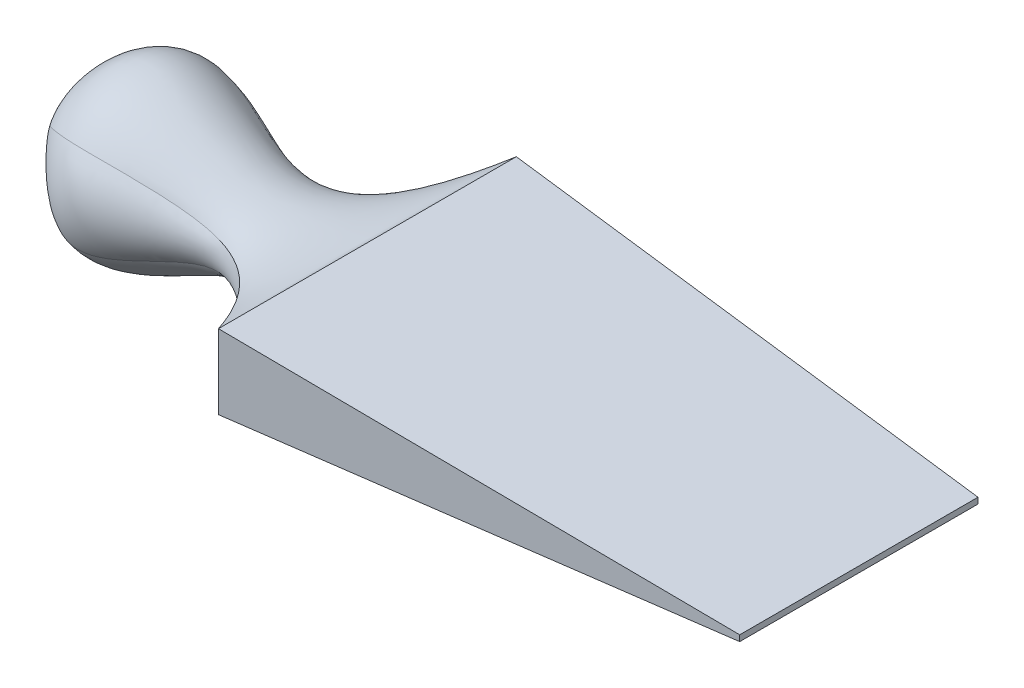
ISO-10303-21;
HEADER;
FILE_DESCRIPTION(('STEP AP214'),'2;1');
FILE_NAME('part.step','',(''),(''),'','','');
FILE_SCHEMA(('AUTOMOTIVE_DESIGN { 1 0 10303 214 1 1 1 1 }'));
ENDSEC;
DATA;
#1=APPLICATION_CONTEXT('core data for automotive mechanical design processes');
#2=APPLICATION_PROTOCOL_DEFINITION('international standard','automotive_design',2000,#1);
#3=PRODUCT_CONTEXT('',#1,'mechanical');
#4=PRODUCT('Part','Part','',(#3));
#5=PRODUCT_RELATED_PRODUCT_CATEGORY('part','',(#4));
#6=PRODUCT_DEFINITION_FORMATION('','',#4);
#7=PRODUCT_DEFINITION_CONTEXT('part definition',#1,'design');
#8=PRODUCT_DEFINITION('design','',#6,#7);
#9=PRODUCT_DEFINITION_SHAPE('','',#8);
#10=(LENGTH_UNIT() NAMED_UNIT(*) SI_UNIT(.MILLI.,.METRE.));
#11=(NAMED_UNIT(*) PLANE_ANGLE_UNIT() SI_UNIT($,.RADIAN.));
#12=(NAMED_UNIT(*) SI_UNIT($,.STERADIAN.) SOLID_ANGLE_UNIT());
#13=UNCERTAINTY_MEASURE_WITH_UNIT(LENGTH_MEASURE(1.E-05),#10,'distance_accuracy_value','');
#14=(GEOMETRIC_REPRESENTATION_CONTEXT(3) GLOBAL_UNCERTAINTY_ASSIGNED_CONTEXT((#13)) GLOBAL_UNIT_ASSIGNED_CONTEXT((#10,
#11,#12)) REPRESENTATION_CONTEXT('',''));
#15=CARTESIAN_POINT('',(0.,0.,0.));
#16=DIRECTION('',(0.,0.,1.));
#17=DIRECTION('',(1.,0.,0.));
#18=AXIS2_PLACEMENT_3D('',#15,#16,#17);
#19=CARTESIAN_POINT('',(0.,0.,0.));
#20=DIRECTION('',(1.,0.,0.));
#21=DIRECTION('',(0.,0.,-1.));
#22=AXIS2_PLACEMENT_3D('',#19,#20,#21);
#23=PLANE('',#22);
#24=CARTESIAN_POINT('',(0.,0.,0.));
#25=DIRECTION('',(1.,0.,0.));
#26=DIRECTION('',(0.,0.,-1.));
#27=AXIS2_PLACEMENT_3D('',#24,#25,#26);
#28=CIRCLE('',#27,12.5);
#29=CARTESIAN_POINT('',(0.,-5.,11.4564392373896));
#30=VERTEX_POINT('',#29);
#31=CARTESIAN_POINT('',(0.,-5.,-11.4564392373896));
#32=VERTEX_POINT('',#31);
#33=EDGE_CURVE('E202',#30,#32,#28,.T.);
#34=ORIENTED_EDGE('',*,*,#33,.F.);
#35=CARTESIAN_POINT('',(0.,0.,0.));
#36=DIRECTION('',(1.,0.,0.));
#37=DIRECTION('',(0.,0.,-1.));
#38=AXIS2_PLACEMENT_3D('',#35,#36,#37);
#39=CIRCLE('',#38,12.5);
#40=CARTESIAN_POINT('',(0.,5.,11.4564392373896));
#41=VERTEX_POINT('',#40);
#42=EDGE_CURVE('E374',#41,#30,#39,.T.);
#43=ORIENTED_EDGE('',*,*,#42,.F.);
#44=CARTESIAN_POINT('',(0.,0.,0.));
#45=DIRECTION('',(1.,0.,0.));
#46=DIRECTION('',(0.,0.,-1.));
#47=AXIS2_PLACEMENT_3D('',#44,#45,#46);
#48=CIRCLE('',#47,12.5);
#49=CARTESIAN_POINT('',(0.,5.,-11.4564392373896));
#50=VERTEX_POINT('',#49);
#51=EDGE_CURVE('E371',#50,#41,#48,.T.);
#52=ORIENTED_EDGE('',*,*,#51,.F.);
#53=CARTESIAN_POINT('',(0.,0.,0.));
#54=DIRECTION('',(1.,0.,0.));
#55=DIRECTION('',(0.,0.,-1.));
#56=AXIS2_PLACEMENT_3D('',#53,#54,#55);
#57=CIRCLE('',#56,12.5);
#58=EDGE_CURVE('E365',#32,#50,#57,.T.);
#59=ORIENTED_EDGE('',*,*,#58,.F.);
#60=EDGE_LOOP('',(#34,#43,#52,#59));
#61=FACE_BOUND('',#60,.T.);
#62=ADVANCED_FACE('F135',(#61),#23,.F.);
#63=CARTESIAN_POINT('',(0.,5.,-11.4564392373896));
#64=CARTESIAN_POINT('',(6.41191300264353,11.6666666666667,-18.6560882982515));
#65=CARTESIAN_POINT('',(23.2263205782851,20.1123380947418,-29.2990996489488));
#66=CARTESIAN_POINT('',(63.2802605538412,-1.50808446607532,-4.35100390714433));
#67=CARTESIAN_POINT('',(85.5143825220001,7.03840947148888,-32.3354994597791));
#68=CARTESIAN_POINT('',(95.,12.5,-50.));
#69=CARTESIAN_POINT('',(0.,5.56929795703813,-11.2079772391886));
#70=CARTESIAN_POINT('',(6.42664193431137,12.4971865575916,-18.1575037753541));
#71=CARTESIAN_POINT('',(23.1984917529609,21.270108670659,-28.4253912214045));
#72=CARTESIAN_POINT('',(63.3860937463977,-1.01073181610584,-4.58621006387801));
#73=CARTESIAN_POINT('',(85.2828532490108,7.24662510442955,-31.0512557618582));
#74=CARTESIAN_POINT('',(95.,12.5,-47.9166666666667));
#75=CARTESIAN_POINT('',(0.,6.65760381678448,-10.6323557964822));
#76=CARTESIAN_POINT('',(6.45609979764703,14.1079362851116,-17.081637283255));
#77=CARTESIAN_POINT('',(23.1428341023124,23.444988125311,-26.5453073197433));
#78=CARTESIAN_POINT('',(63.5977601315107,-0.0531417865237106,-4.90949361025798));
#79=CARTESIAN_POINT('',(84.8197947030323,7.66305637031087,-28.4827683660165));
#80=CARTESIAN_POINT('',(95.,12.5,-43.75));
#81=CARTESIAN_POINT('',(0.,8.12364351611543,-9.55824693931548));
#82=CARTESIAN_POINT('',(6.5021272928099,16.2379392648913,-15.1903540063716));
#83=CARTESIAN_POINT('',(23.0672338014187,26.3578267016896,-23.4198614477124));
#84=CARTESIAN_POINT('',(63.8571458640914,1.22489905941701,-5.00449484080783));
#85=CARTESIAN_POINT('',(84.2590731104145,8.26833454075916,-24.5749695835259));
#86=CARTESIAN_POINT('',(95.,12.5,-37.5));
#87=CARTESIAN_POINT('',(0.,9.4074025376424,-8.2949078265483));
#88=CARTESIAN_POINT('',(6.54628208957465,18.095301214863,-13.067937089994));
#89=CARTESIAN_POINT('',(23.0001692777491,28.8747201513023,-20.0074737548163));
#90=CARTESIAN_POINT('',(64.0717025734444,2.34494680076933,-4.75451143709999));
#91=CARTESIAN_POINT('',(83.7993834855614,8.82687950818607,-20.6167472125723));
#92=CARTESIAN_POINT('',(95.,12.5,-31.25));
#93=CARTESIAN_POINT('',(0.,10.4935684746193,-6.8708482752449));
#94=CARTESIAN_POINT('',(6.58644672825378,19.6541432374652,-10.7444055813292));
#95=CARTESIAN_POINT('',(22.9435580585204,30.9818583333891,-16.3547548632711));
#96=CARTESIAN_POINT('',(64.239293220393,3.29355283189509,-4.21520222177458));
#97=CARTESIAN_POINT('',(83.4441669681606,9.31750980466101,-16.6033142756648));
#98=CARTESIAN_POINT('',(95.0000000000001,12.5,-25.));
#99=CARTESIAN_POINT('',(0.,11.3658681489191,-5.30146924344234));
#100=CARTESIAN_POINT('',(6.6204753823662,20.8982680140326,-8.24120554334582));
#101=CARTESIAN_POINT('',(22.8983801526566,32.6560841627058,-12.4854247718238));
#102=CARTESIAN_POINT('',(64.3637988822484,4.05811140024668,-3.4190617078093));
#103=CARTESIAN_POINT('',(83.1831118736503,9.72128227914918,-12.5284120869177));
#104=CARTESIAN_POINT('',(95.,12.5,-18.75));
#105=CARTESIAN_POINT('',(0.,12.2238916613032,-3.06872194109888));
#106=CARTESIAN_POINT('',(6.65508283104416,22.1140075692923,-4.7290102248692));
#107=CARTESIAN_POINT('',(22.8545385692974,34.2857343916385,-7.11631227057402));
#108=CARTESIAN_POINT('',(64.4772091938432,4.81400019397265,-2.11130417649516));
#109=CARTESIAN_POINT('',(82.9477692601741,10.1247546648565,-7.03174685640084));
#110=CARTESIAN_POINT('',(95.,12.5,-10.4166666666667));
#111=CARTESIAN_POINT('',(0.,12.684936871926,0.000294326214996064));
#112=CARTESIAN_POINT('',(6.67438812005031,22.7582851121755,0.000217356233585051));
#113=CARTESIAN_POINT('',(22.8318982353285,35.1413305384259,0.000123591825538922));
#114=CARTESIAN_POINT('',(64.5290726638304,5.22645978971525,0.000615983830276927));
#115=CARTESIAN_POINT('',(82.8425039745136,10.3446131745451,0.000255330200963255));
#116=CARTESIAN_POINT('',(94.9999999999999,12.5,0.));
#117=CARTESIAN_POINT('',(0.,12.2239744019173,3.06814843259711));
#118=CARTESIAN_POINT('',(6.65508413427711,22.1140668097763,4.72858660393389));
#119=CARTESIAN_POINT('',(22.8545391814698,34.2857619091397,7.11607117096969));
#120=CARTESIAN_POINT('',(64.4771992572305,4.81412512579039,2.11010360492033));
#121=CARTESIAN_POINT('',(82.947792819549,10.1248004635565,7.03125026659206));
#122=CARTESIAN_POINT('',(95.,12.5,10.4166666666667));
#123=CARTESIAN_POINT('',(0.,11.3658827655001,5.30156926292863));
#124=CARTESIAN_POINT('',(6.62047506930006,20.898278499569,8.2412793983885));
#125=CARTESIAN_POINT('',(22.8983801732534,32.656089163326,12.485466781579));
#126=CARTESIAN_POINT('',(64.3638002167589,4.05813284519394,3.41927113329063));
#127=CARTESIAN_POINT('',(83.1831086159785,9.72129170993612,12.5284988294702));
#128=CARTESIAN_POINT('',(95.,12.5,18.75));
#129=CARTESIAN_POINT('',(0.,10.4935539686113,6.87081060195519));
#130=CARTESIAN_POINT('',(6.58644692038112,19.6541328360049,10.7443777766362));
#131=CARTESIAN_POINT('',(22.9435580226048,30.981853409201,16.3547390604383));
#132=CARTESIAN_POINT('',(64.2392925475263,3.29353138907563,4.21512323614691));
#133=CARTESIAN_POINT('',(83.4441686339354,9.31750078345068,16.6032817689567));
#134=CARTESIAN_POINT('',(95.,12.5,25.));
#135=CARTESIAN_POINT('',(0.,9.40741116577761,8.29492611244274));
#136=CARTESIAN_POINT('',(6.54628195517983,18.0953074072743,13.0679505879669));
#137=CARTESIAN_POINT('',(23.000169293446,28.8747230737873,20.0074814042585));
#138=CARTESIAN_POINT('',(64.0717031032973,2.34495956295425,4.75454988296231));
#139=CARTESIAN_POINT('',(83.7993821852937,8.82688486128617,20.6167627600584));
#140=CARTESIAN_POINT('',(95.,12.5,31.25));
#141=CARTESIAN_POINT('',(0.,8.12363872286207,9.55823724344302));
#142=CARTESIAN_POINT('',(6.50212738217082,16.2379358017229,15.1903468109489));
#143=CARTESIAN_POINT('',(23.0672337968516,26.357825100244,23.4198574413084));
#144=CARTESIAN_POINT('',(63.8571454749353,1.22489193865455,5.0044743236788));
#145=CARTESIAN_POINT('',(84.2590740590731,8.26833162164392,24.5749616124625));
#146=CARTESIAN_POINT('',(95.,12.5,37.5));
#147=CARTESIAN_POINT('',(0.,6.65760649398594,10.6323611566093));
#148=CARTESIAN_POINT('',(6.45609974603593,14.1079383057344,17.081641419731));
#149=CARTESIAN_POINT('',(23.1428341028032,23.4449889375435,26.545309368217));
#150=CARTESIAN_POINT('',(63.5977603697492,-0.0531376964970956,4.90950525562504));
#151=CARTESIAN_POINT('',(84.819794124369,7.66305780176876,28.4827721889498));
#152=CARTESIAN_POINT('',(95.,12.5,43.75));
#153=CARTESIAN_POINT('',(0.,5.56929795703812,11.2079772391886));
#154=CARTESIAN_POINT('',(6.42664191710766,12.4971863387321,18.1575033674704));
#155=CARTESIAN_POINT('',(23.1984917531245,21.2701088773331,28.4253916334564));
#156=CARTESIAN_POINT('',(63.3860938258105,-1.01073209022136,4.58620938428347));
#157=CARTESIAN_POINT('',(85.282853056123,7.24662558158218,31.0512570361693));
#158=CARTESIAN_POINT('',(95.,12.5,47.9166666666667));
#159=CARTESIAN_POINT('',(0.,5.,11.4564392373896));
#160=CARTESIAN_POINT('',(6.41191300264353,11.6666666666667,18.6560882982515));
#161=CARTESIAN_POINT('',(23.2263205782851,20.1123380947418,29.2990996489488));
#162=CARTESIAN_POINT('',(63.2802605538412,-1.50808446607532,4.35100390714433));
#163=CARTESIAN_POINT('',(85.5143825220001,7.03840947148888,32.335499459779));
#164=CARTESIAN_POINT('',(95.,12.5,50.));
#165=B_SPLINE_SURFACE_WITH_KNOTS('',3,3,((#63,#64,#65,#66,#67,#68),(#69,#70,#71,#72,#73,#74),
(#75,#76,#77,#78,#79,#80),(#81,#82,#83,#84,#85,#86),(#87,#88,#89,#90,#91,#92),(#93,#94,#95,#96,
#97,#98),(#99,#100,#101,#102,#103,#104),(#105,#106,#107,#108,#109,#110),(#111,#112,#113,#114,
#115,#116),(#117,#118,#119,#120,#121,#122),(#123,#124,#125,#126,#127,#128),(#129,#130,#131,#132,
#133,#134),(#135,#136,#137,#138,#139,#140),(#141,#142,#143,#144,#145,#146),(#147,#148,#149,#150,
#151,#152),(#153,#154,#155,#156,#157,#158),(#159,#160,#161,#162,#163,#164)),.UNSPECIFIED.,.F.,
.F.,.F.,(4,1,1,1,1,1,1,1,1,1,1,1,1,1,4),(4,1,1,4),(0.,0.0625,0.125,0.1875,0.25,0.3125,0.375,0.5,
0.625,0.6875,0.75,0.8125,0.875,0.9375,1.),(0.,0.223343032829864,0.596263452143931,1.),.UNSPECIFIED.);
#166=CARTESIAN_POINT('',(0.,5.,11.4564392373896));
#167=CARTESIAN_POINT('',(6.41191300264353,11.6666666666667,18.6560882982515));
#168=CARTESIAN_POINT('',(23.2263205782851,20.1123380947418,29.2990996489488));
#169=CARTESIAN_POINT('',(63.2802605538412,-1.50808446607532,4.35100390714433));
#170=CARTESIAN_POINT('',(85.5143825220001,7.03840947148888,32.335499459779));
#171=CARTESIAN_POINT('',(95.,12.5,50.));
#172=B_SPLINE_CURVE_WITH_KNOTS('',3,(#166,#167,#168,#169,#170,#171),.UNSPECIFIED.,.F.,.F.,(4,1,
1,4),(0.,0.223343032829864,0.596263452143931,1.),.UNSPECIFIED.);
#173=CARTESIAN_POINT('',(95.,12.5,50.));
#174=VERTEX_POINT('',#173);
#175=EDGE_CURVE('E388',#41,#174,#172,.T.);
#176=DIRECTION('',(0.,0.,1.));
#177=VECTOR('',#176,1.);
#178=CARTESIAN_POINT('',(95.,12.5,50.));
#179=LINE('',#178,#177);
#180=CARTESIAN_POINT('',(95.,12.5,-50.));
#181=VERTEX_POINT('',#180);
#182=EDGE_CURVE('E164',#181,#174,#179,.T.);
#183=CARTESIAN_POINT('',(0.,5.,-11.4564392373896));
#184=CARTESIAN_POINT('',(6.41191300264353,11.6666666666667,-18.6560882982515));
#185=CARTESIAN_POINT('',(23.2263205782851,20.1123380947418,-29.2990996489488));
#186=CARTESIAN_POINT('',(63.2802605538412,-1.50808446607532,-4.35100390714433));
#187=CARTESIAN_POINT('',(85.5143825220001,7.03840947148888,-32.3354994597791));
#188=CARTESIAN_POINT('',(95.,12.5,-50.));
#189=B_SPLINE_CURVE_WITH_KNOTS('',3,(#183,#184,#185,#186,#187,#188),.UNSPECIFIED.,.F.,.F.,(4,1,
1,4),(0.,0.223343032829864,0.596263452143931,1.),.UNSPECIFIED.);
#190=EDGE_CURVE('E211',#181,#50,#189,.F.);
#191=ORIENTED_EDGE('',*,*,#51,.T.);
#192=ORIENTED_EDGE('',*,*,#175,.T.);
#193=ORIENTED_EDGE('',*,*,#182,.F.);
#194=ORIENTED_EDGE('',*,*,#190,.T.);
#195=EDGE_LOOP('',(#191,#192,#193,#194));
#196=FACE_BOUND('',#195,.T.);
#197=ADVANCED_FACE('F340',(#196),#165,.T.);
#198=CARTESIAN_POINT('',(0.,5.,11.4564392373896));
#199=CARTESIAN_POINT('',(6.41191300264353,11.6666666666667,18.6560882982515));
#200=CARTESIAN_POINT('',(23.2263205782851,20.1123380947418,29.2990996489488));
#201=CARTESIAN_POINT('',(63.2802605538412,-1.50808446607532,4.35100390714432));
#202=CARTESIAN_POINT('',(85.5143825220001,7.03840947148889,32.335499459779));
#203=CARTESIAN_POINT('',(95.,12.5,50.));
#204=CARTESIAN_POINT('',(0.,1.8120380746196,12.847779888408));
#205=CARTESIAN_POINT('',(6.41191300264353,4.03426029684182,20.0474289492698));
#206=CARTESIAN_POINT('',(23.2263205782851,8.3319323929479,39.6234323422801));
#207=CARTESIAN_POINT('',(63.2802605538412,-0.85345170263655,3.95967795416336));
#208=CARTESIAN_POINT('',(85.5143825220001,2.3461364904963,32.335499459779));
#209=CARTESIAN_POINT('',(95.,4.16666666666667,50.));
#210=CARTESIAN_POINT('',(0.,-1.81203807461959,12.847779888408));
#211=CARTESIAN_POINT('',(6.41191300264353,-4.03426029684182,20.0474289492698));
#212=CARTESIAN_POINT('',(23.2263205782851,-8.33193239294791,39.6234323422801));
#213=CARTESIAN_POINT('',(63.2802605538412,0.853451702636566,3.95967795416337));
#214=CARTESIAN_POINT('',(85.5143825220001,-2.34613649049629,32.335499459779));
#215=CARTESIAN_POINT('',(95.,-4.16666666666666,50.));
#216=CARTESIAN_POINT('',(0.,-4.99999999999999,11.4564392373896));
#217=CARTESIAN_POINT('',(6.41191300264353,-11.6666666666667,18.6560882982515));
#218=CARTESIAN_POINT('',(23.2263205782851,-20.1123380947418,29.2990996489488));
#219=CARTESIAN_POINT('',(63.2802605538412,1.50808446607533,4.35100390714434));
#220=CARTESIAN_POINT('',(85.5143825220001,-7.03840947148888,32.335499459779));
#221=CARTESIAN_POINT('',(95.,-12.5,50.));
#222=B_SPLINE_SURFACE_WITH_KNOTS('',3,3,((#198,#199,#200,#201,#202,#203),(#204,#205,#206,#207,
#208,#209),(#210,#211,#212,#213,#214,#215),(#216,#217,#218,#219,#220,#221)),.UNSPECIFIED.,.F.,
.F.,.F.,(4,4),(4,1,1,4),(0.,1.),(0.,0.223343032829864,0.596263452143931,1.),.UNSPECIFIED.);
#223=CARTESIAN_POINT('',(0.,-4.99999999999999,11.4564392373896));
#224=CARTESIAN_POINT('',(6.41191300264353,-11.6666666666667,18.6560882982515));
#225=CARTESIAN_POINT('',(23.2263205782851,-20.1123380947418,29.2990996489488));
#226=CARTESIAN_POINT('',(63.2802605538412,1.50808446607533,4.35100390714434));
#227=CARTESIAN_POINT('',(85.5143825220001,-7.03840947148888,32.335499459779));
#228=CARTESIAN_POINT('',(95.,-12.5,50.));
#229=B_SPLINE_CURVE_WITH_KNOTS('',3,(#223,#224,#225,#226,#227,#228),.UNSPECIFIED.,.F.,.F.,(4,1,
1,4),(0.,0.223343032829864,0.596263452143931,1.),.UNSPECIFIED.);
#230=CARTESIAN_POINT('',(95.,-12.5,50.));
#231=VERTEX_POINT('',#230);
#232=EDGE_CURVE('E156',#30,#231,#229,.T.);
#233=DIRECTION('',(0.,-1.,0.));
#234=VECTOR('',#233,1.);
#235=CARTESIAN_POINT('',(95.,-12.5,50.));
#236=LINE('',#235,#234);
#237=EDGE_CURVE('E148',#174,#231,#236,.T.);
#238=ORIENTED_EDGE('',*,*,#42,.T.);
#239=ORIENTED_EDGE('',*,*,#232,.T.);
#240=ORIENTED_EDGE('',*,*,#237,.F.);
#241=ORIENTED_EDGE('',*,*,#175,.F.);
#242=EDGE_LOOP('',(#238,#239,#240,#241));
#243=FACE_BOUND('',#242,.T.);
#244=ADVANCED_FACE('F391',(#243),#222,.T.);
#245=CARTESIAN_POINT('',(0.,-5.,-11.4564392373896));
#246=CARTESIAN_POINT('',(6.41191300264353,-11.6666666666667,-18.6560882982515));
#247=CARTESIAN_POINT('',(23.2263205782851,-20.1123380947417,-29.2990996489488));
#248=CARTESIAN_POINT('',(63.2802605538412,1.50808446607531,-4.35100390714432));
#249=CARTESIAN_POINT('',(85.5143825220001,-7.03840947148888,-32.3354994597791));
#250=CARTESIAN_POINT('',(95.,-12.5,-50.));
#251=CARTESIAN_POINT('',(0.,-1.8120380746196,-12.847779888408));
#252=CARTESIAN_POINT('',(6.41191300264353,-4.03426029684182,-20.0474289492698));
#253=CARTESIAN_POINT('',(23.2263205782851,-8.3319323929479,-39.6234323422801));
#254=CARTESIAN_POINT('',(63.2802605538412,0.85345170263655,-3.95967795416336));
#255=CARTESIAN_POINT('',(85.5143825220001,-2.34613649049629,-32.3354994597791));
#256=CARTESIAN_POINT('',(95.,-4.16666666666666,-50.));
#257=CARTESIAN_POINT('',(0.,1.81203807461959,-12.847779888408));
#258=CARTESIAN_POINT('',(6.41191300264353,4.03426029684181,-20.0474289492699));
#259=CARTESIAN_POINT('',(23.2263205782851,8.33193239294789,-39.6234323422801));
#260=CARTESIAN_POINT('',(63.2802605538412,-0.853451702636556,-3.95967795416337));
#261=CARTESIAN_POINT('',(85.5143825220001,2.3461364904963,-32.3354994597791));
#262=CARTESIAN_POINT('',(95.,4.16666666666667,-50.));
#263=CARTESIAN_POINT('',(0.,5.,-11.4564392373896));
#264=CARTESIAN_POINT('',(6.41191300264353,11.6666666666667,-18.6560882982515));
#265=CARTESIAN_POINT('',(23.2263205782851,20.1123380947417,-29.2990996489488));
#266=CARTESIAN_POINT('',(63.2802605538412,-1.50808446607532,-4.35100390714432));
#267=CARTESIAN_POINT('',(85.5143825220001,7.03840947148888,-32.3354994597791));
#268=CARTESIAN_POINT('',(95.,12.5,-50.));
#269=B_SPLINE_SURFACE_WITH_KNOTS('',3,3,((#245,#246,#247,#248,#249,#250),(#251,#252,#253,#254,
#255,#256),(#257,#258,#259,#260,#261,#262),(#263,#264,#265,#266,#267,#268)),.UNSPECIFIED.,.F.,
.F.,.F.,(4,4),(4,1,1,4),(0.,1.),(0.,0.223343032829864,0.596263452143931,1.),.UNSPECIFIED.);
#270=DIRECTION('',(0.,1.,0.));
#271=VECTOR('',#270,1.);
#272=CARTESIAN_POINT('',(95.,-12.5,-50.));
#273=LINE('',#272,#271);
#274=CARTESIAN_POINT('',(95.,-12.5,-50.));
#275=VERTEX_POINT('',#274);
#276=EDGE_CURVE('E142',#275,#181,#273,.T.);
#277=CARTESIAN_POINT('',(0.,-5.,-11.4564392373896));
#278=CARTESIAN_POINT('',(6.41191300264353,-11.6666666666667,-18.6560882982515));
#279=CARTESIAN_POINT('',(23.2263205782851,-20.1123380947418,-29.2990996489488));
#280=CARTESIAN_POINT('',(63.2802605538412,1.50808446607531,-4.35100390714432));
#281=CARTESIAN_POINT('',(85.5143825220001,-7.03840947148889,-32.3354994597791));
#282=CARTESIAN_POINT('',(95.,-12.5,-50.));
#283=B_SPLINE_CURVE_WITH_KNOTS('',3,(#277,#278,#279,#280,#281,#282),.UNSPECIFIED.,.F.,.F.,(4,1,
1,4),(0.,0.223343032829864,0.596263452143931,1.),.UNSPECIFIED.);
#284=EDGE_CURVE('E197',#32,#275,#283,.T.);
#285=ORIENTED_EDGE('',*,*,#58,.T.);
#286=ORIENTED_EDGE('',*,*,#190,.F.);
#287=ORIENTED_EDGE('',*,*,#276,.F.);
#288=ORIENTED_EDGE('',*,*,#284,.F.);
#289=EDGE_LOOP('',(#285,#286,#287,#288));
#290=FACE_BOUND('',#289,.T.);
#291=ADVANCED_FACE('F210',(#290),#269,.T.);
#292=CARTESIAN_POINT('',(0.,-4.99999999999999,11.4564392373896));
#293=CARTESIAN_POINT('',(6.41191300264354,-11.6666666666667,18.6560882982515));
#294=CARTESIAN_POINT('',(23.2263205782851,-20.1123380947418,29.2990996489488));
#295=CARTESIAN_POINT('',(63.2802605538412,1.50808446607533,4.35100390714434));
#296=CARTESIAN_POINT('',(85.5143825220001,-7.03840947148888,32.335499459779));
#297=CARTESIAN_POINT('',(95.,-12.5,50.));
#298=CARTESIAN_POINT('',(0.,-5.56929795703812,11.2079772391886));
#299=CARTESIAN_POINT('',(6.42664193431137,-12.4971865575916,18.1575037753541));
#300=CARTESIAN_POINT('',(23.1984917529609,-21.270108670659,28.4253912214045));
#301=CARTESIAN_POINT('',(63.3860937463977,1.01073181610585,4.58621006387802));
#302=CARTESIAN_POINT('',(85.2828532490108,-7.24662510442954,31.0512557618582));
#303=CARTESIAN_POINT('',(95.,-12.5,47.9166666666667));
#304=CARTESIAN_POINT('',(0.,-6.65760381678446,10.6323557964822));
#305=CARTESIAN_POINT('',(6.45609979764704,-14.1079362851115,17.081637283255));
#306=CARTESIAN_POINT('',(23.1428341023124,-23.444988125311,26.5453073197432));
#307=CARTESIAN_POINT('',(63.5977601315107,0.0531417865237324,4.90949361025803));
#308=CARTESIAN_POINT('',(84.8197947030323,-7.66305637031085,28.4827683660165));
#309=CARTESIAN_POINT('',(95.,-12.5,43.75));
#310=CARTESIAN_POINT('',(0.,-8.12364351611544,9.55824693931549));
#311=CARTESIAN_POINT('',(6.5021272928099,-16.2379392648913,15.1903540063717));
#312=CARTESIAN_POINT('',(23.0672338014187,-26.3578267016896,23.4198614477124));
#313=CARTESIAN_POINT('',(63.8571458640914,-1.22489905941701,5.00449484080782));
#314=CARTESIAN_POINT('',(84.2590731104145,-8.26833454075918,24.5749695835259));
#315=CARTESIAN_POINT('',(95.,-12.5,37.5));
#316=CARTESIAN_POINT('',(0.,-9.40740253764238,8.29490782654831));
#317=CARTESIAN_POINT('',(6.54628208957466,-18.095301214863,13.067937089994));
#318=CARTESIAN_POINT('',(23.0001692777491,-28.8747201513024,20.0074737548163));
#319=CARTESIAN_POINT('',(64.0717025734444,-2.34494680076929,4.75451143710004));
#320=CARTESIAN_POINT('',(83.7993834855614,-8.82687950818604,20.6167472125723));
#321=CARTESIAN_POINT('',(95.,-12.5,31.25));
#322=CARTESIAN_POINT('',(0.,-10.4935684746193,6.87084827524491));
#323=CARTESIAN_POINT('',(6.58644672825377,-19.6541432374651,10.7444055813292));
#324=CARTESIAN_POINT('',(22.9435580585204,-30.9818583333891,16.3547548632711));
#325=CARTESIAN_POINT('',(64.239293220393,-3.29355283189509,4.2152022217746));
#326=CARTESIAN_POINT('',(83.4441669681606,-9.31750980466101,16.6033142756648));
#327=CARTESIAN_POINT('',(95.0000000000001,-12.5,25.));
#328=CARTESIAN_POINT('',(0.,-11.3658681489191,5.30146924344236));
#329=CARTESIAN_POINT('',(6.62047538236622,-20.8982680140327,8.24120554334582));
#330=CARTESIAN_POINT('',(22.8983801526567,-32.6560841627058,12.4854247718238));
#331=CARTESIAN_POINT('',(64.3637988822484,-4.05811140024666,3.41906170780931));
#332=CARTESIAN_POINT('',(83.1831118736503,-9.72128227914919,12.5284120869177));
#333=CARTESIAN_POINT('',(95.,-12.5,18.75));
#334=CARTESIAN_POINT('',(0.,-12.2238916613033,3.06872194109887));
#335=CARTESIAN_POINT('',(6.65508283104414,-22.1140075692923,4.72901022486918));
#336=CARTESIAN_POINT('',(22.8545385692974,-34.2857343916385,7.11631227057395));
#337=CARTESIAN_POINT('',(64.4772091938432,-4.81400019397263,2.1113041764952));
#338=CARTESIAN_POINT('',(82.947769260174,-10.1247546648565,7.03174685640083));
#339=CARTESIAN_POINT('',(95.,-12.5,10.4166666666667));
#340=CARTESIAN_POINT('',(0.,-12.6849368719259,-0.000294326214973512));
#341=CARTESIAN_POINT('',(6.67438812005032,-22.7582851121755,-0.0002173562335625));
#342=CARTESIAN_POINT('',(22.8318982353285,-35.1413305384259,-0.000123591825506509));
#343=CARTESIAN_POINT('',(64.5290726638305,-5.22645978971529,-0.000615983830264448));
#344=CARTESIAN_POINT('',(82.8425039745136,-10.3446131745452,-0.000255330200970381));
#345=CARTESIAN_POINT('',(94.9999999999999,-12.5,0.));
#346=CARTESIAN_POINT('',(0.,-12.2239744019174,-3.06814843259711));
#347=CARTESIAN_POINT('',(6.65508413427711,-22.1140668097763,-4.7285866039339));
#348=CARTESIAN_POINT('',(22.8545391814698,-34.2857619091397,-7.11607117096974));
#349=CARTESIAN_POINT('',(64.4771992572305,-4.81412512579036,-2.11010360492031));
#350=CARTESIAN_POINT('',(82.9477928195489,-10.1248004635564,-7.03125026659204));
#351=CARTESIAN_POINT('',(95.,-12.5,-10.4166666666667));
#352=CARTESIAN_POINT('',(0.,-11.3658827655001,-5.30156926292863));
#353=CARTESIAN_POINT('',(6.62047506930006,-20.898278499569,-8.24127939838851));
#354=CARTESIAN_POINT('',(22.8983801732534,-32.6560891633259,-12.485466781579));
#355=CARTESIAN_POINT('',(64.3638002167589,-4.05813284519399,-3.4192711332906));
#356=CARTESIAN_POINT('',(83.1831086159786,-9.72129170993614,-12.5284988294702));
#357=CARTESIAN_POINT('',(95.,-12.5,-18.75));
#358=CARTESIAN_POINT('',(0.,-10.4935539686113,-6.87081060195519));
#359=CARTESIAN_POINT('',(6.58644692038112,-19.654132836005,-10.7443777766362));
#360=CARTESIAN_POINT('',(22.9435580226049,-30.981853409201,-16.3547390604383));
#361=CARTESIAN_POINT('',(64.2392925475262,-3.29353138907559,-4.21512323614688));
#362=CARTESIAN_POINT('',(83.4441686339354,-9.31750078345068,-16.6032817689567));
#363=CARTESIAN_POINT('',(95.,-12.5,-25.));
#364=CARTESIAN_POINT('',(0.,-9.40741116577761,-8.29492611244274));
#365=CARTESIAN_POINT('',(6.54628195517983,-18.0953074072742,-13.067950587967));
#366=CARTESIAN_POINT('',(23.0001692934459,-28.8747230737872,-20.0074814042586));
#367=CARTESIAN_POINT('',(64.0717031032973,-2.34495956295429,-4.7545498829623));
#368=CARTESIAN_POINT('',(83.7993821852937,-8.82688486128617,-20.6167627600584));
#369=CARTESIAN_POINT('',(95.,-12.5,-31.25));
#370=CARTESIAN_POINT('',(0.,-8.12363872286208,-9.55823724344302));
#371=CARTESIAN_POINT('',(6.50212738217083,-16.2379358017229,-15.1903468109489));
#372=CARTESIAN_POINT('',(23.0672337968516,-26.357825100244,-23.4198574413084));
#373=CARTESIAN_POINT('',(63.8571454749352,-1.22489193865454,-5.00447432367877));
#374=CARTESIAN_POINT('',(84.2590740590731,-8.26833162164391,-24.5749616124625));
#375=CARTESIAN_POINT('',(95.,-12.5,-37.5));
#376=CARTESIAN_POINT('',(0.,-6.65760649398594,-10.6323611566093));
#377=CARTESIAN_POINT('',(6.45609974603593,-14.1079383057344,-17.081641419731));
#378=CARTESIAN_POINT('',(23.1428341028032,-23.4449889375434,-26.545309368217));
#379=CARTESIAN_POINT('',(63.5977603697492,0.0531376964970581,-4.90950525562502));
#380=CARTESIAN_POINT('',(84.819794124369,-7.66305780176878,-28.4827721889498));
#381=CARTESIAN_POINT('',(95.,-12.5,-43.75));
#382=CARTESIAN_POINT('',(0.,-5.56929795703813,-11.2079772391886));
#383=CARTESIAN_POINT('',(6.42664191710766,-12.497186338732,-18.1575033674704));
#384=CARTESIAN_POINT('',(23.1984917531245,-21.2701088773331,-28.4253916334564));
#385=CARTESIAN_POINT('',(63.3860938258105,1.01073209022135,-4.58620938428348));
#386=CARTESIAN_POINT('',(85.282853056123,-7.24662558158218,-31.0512570361693));
#387=CARTESIAN_POINT('',(95.,-12.5,-47.9166666666667));
#388=CARTESIAN_POINT('',(0.,-5.,-11.4564392373896));
#389=CARTESIAN_POINT('',(6.41191300264353,-11.6666666666667,-18.6560882982515));
#390=CARTESIAN_POINT('',(23.2263205782851,-20.1123380947418,-29.2990996489488));
#391=CARTESIAN_POINT('',(63.2802605538412,1.50808446607531,-4.35100390714432));
#392=CARTESIAN_POINT('',(85.5143825220001,-7.03840947148889,-32.3354994597791));
#393=CARTESIAN_POINT('',(95.,-12.5,-50.));
#394=B_SPLINE_SURFACE_WITH_KNOTS('',3,3,((#292,#293,#294,#295,#296,#297),(#298,#299,#300,#301,
#302,#303),(#304,#305,#306,#307,#308,#309),(#310,#311,#312,#313,#314,#315),(#316,#317,#318,#319,
#320,#321),(#322,#323,#324,#325,#326,#327),(#328,#329,#330,#331,#332,#333),(#334,#335,#336,#337,
#338,#339),(#340,#341,#342,#343,#344,#345),(#346,#347,#348,#349,#350,#351),(#352,#353,#354,#355,
#356,#357),(#358,#359,#360,#361,#362,#363),(#364,#365,#366,#367,#368,#369),(#370,#371,#372,#373,
#374,#375),(#376,#377,#378,#379,#380,#381),(#382,#383,#384,#385,#386,#387),(#388,#389,#390,#391,
#392,#393)),.UNSPECIFIED.,.F.,.F.,.F.,(4,1,1,1,1,1,1,1,1,1,1,1,1,1,4),(4,1,1,4),(0.,0.0625,
0.125,0.1875,0.25,0.3125,0.375,0.5,0.625,0.6875,0.75,0.8125,0.875,0.9375,1.),(0.,
0.223343032829864,0.596263452143931,1.),.UNSPECIFIED.);
#395=DIRECTION('',(0.,0.,-1.));
#396=VECTOR('',#395,1.);
#397=CARTESIAN_POINT('',(95.,-12.5,50.));
#398=LINE('',#397,#396);
#399=EDGE_CURVE('E12',#231,#275,#398,.T.);
#400=ORIENTED_EDGE('',*,*,#33,.T.);
#401=ORIENTED_EDGE('',*,*,#284,.T.);
#402=ORIENTED_EDGE('',*,*,#399,.F.);
#403=ORIENTED_EDGE('',*,*,#232,.F.);
#404=EDGE_LOOP('',(#400,#401,#402,#403));
#405=FACE_BOUND('',#404,.T.);
#406=ADVANCED_FACE('F137',(#405),#394,.T.);
#407=CARTESIAN_POINT('',(260.,0.,0.));
#408=DIRECTION('',(-1.,0.,0.));
#409=DIRECTION('',(0.,0.,1.));
#410=AXIS2_PLACEMENT_3D('',#407,#408,#409);
#411=PLANE('',#410);
#412=DIRECTION('',(0.,1.,0.));
#413=VECTOR('',#412,1.);
#414=CARTESIAN_POINT('',(260.,-1.,-40.));
#415=LINE('',#414,#413);
#416=CARTESIAN_POINT('',(260.,-1.,-40.));
#417=VERTEX_POINT('',#416);
#418=CARTESIAN_POINT('',(260.,1.,-40.));
#419=VERTEX_POINT('',#418);
#420=EDGE_CURVE('E223',#417,#419,#415,.T.);
#421=ORIENTED_EDGE('',*,*,#420,.T.);
#422=DIRECTION('',(0.,0.,1.));
#423=VECTOR('',#422,1.);
#424=CARTESIAN_POINT('',(260.,1.,40.));
#425=LINE('',#424,#423);
#426=CARTESIAN_POINT('',(260.,1.,40.));
#427=VERTEX_POINT('',#426);
#428=EDGE_CURVE('E538',#419,#427,#425,.T.);
#429=ORIENTED_EDGE('',*,*,#428,.T.);
#430=DIRECTION('',(0.,-1.,0.));
#431=VECTOR('',#430,1.);
#432=CARTESIAN_POINT('',(260.,-1.,40.));
#433=LINE('',#432,#431);
#434=CARTESIAN_POINT('',(260.,-1.,40.));
#435=VERTEX_POINT('',#434);
#436=EDGE_CURVE('E541',#427,#435,#433,.T.);
#437=ORIENTED_EDGE('',*,*,#436,.T.);
#438=DIRECTION('',(0.,0.,-1.));
#439=VECTOR('',#438,1.);
#440=CARTESIAN_POINT('',(260.,-1.,40.));
#441=LINE('',#440,#439);
#442=EDGE_CURVE('E384',#435,#417,#441,.T.);
#443=ORIENTED_EDGE('',*,*,#442,.T.);
#444=EDGE_LOOP('',(#421,#429,#437,#443));
#445=FACE_BOUND('',#444,.T.);
#446=ADVANCED_FACE('F247',(#445),#411,.F.);
#447=CARTESIAN_POINT('',(1.32624806952453,-19.0287766496998,0.));
#448=DIRECTION('',(-0.0695283015937693,0.997579979388864,0.));
#449=DIRECTION('',(-0.997579979388864,-0.0695283015937693,0.));
#450=AXIS2_PLACEMENT_3D('',#447,#448,#449);
#451=PLANE('',#450);
#452=DIRECTION('',(0.995761716561955,0.0694015741846211,0.060349194943149));
#453=VECTOR('',#452,1.);
#454=CARTESIAN_POINT('',(95.,-12.5,-50.));
#455=LINE('',#454,#453);
#456=EDGE_CURVE('E220',#275,#417,#455,.T.);
#457=ORIENTED_EDGE('',*,*,#456,.T.);
#458=ORIENTED_EDGE('',*,*,#442,.F.);
#459=DIRECTION('',(0.995761716561955,0.0694015741846211,-0.0603491949431486));
#460=VECTOR('',#459,1.);
#461=CARTESIAN_POINT('',(95.,-12.5,50.));
#462=LINE('',#461,#460);
#463=EDGE_CURVE('E227',#231,#435,#462,.T.);
#464=ORIENTED_EDGE('',*,*,#463,.F.);
#465=ORIENTED_EDGE('',*,*,#399,.T.);
#466=EDGE_LOOP('',(#457,#458,#464,#465));
#467=FACE_BOUND('',#466,.T.);
#468=ADVANCED_FACE('F231',(#467),#451,.F.);
#469=CARTESIAN_POINT('',(3.36688014638608,0.,55.5535224153705));
#470=DIRECTION('',(-0.0604950604018902,0.,-0.998168496631191));
#471=DIRECTION('',(-0.998168496631191,0.,0.0604950604018902));
#472=AXIS2_PLACEMENT_3D('',#469,#470,#471);
#473=PLANE('',#472);
#474=ORIENTED_EDGE('',*,*,#463,.T.);
#475=ORIENTED_EDGE('',*,*,#436,.F.);
#476=DIRECTION('',(0.995761716561955,-0.0694015741846211,-0.0603491949431486));
#477=VECTOR('',#476,1.);
#478=CARTESIAN_POINT('',(95.,12.5,50.));
#479=LINE('',#478,#477);
#480=EDGE_CURVE('E290',#174,#427,#479,.T.);
#481=ORIENTED_EDGE('',*,*,#480,.F.);
#482=ORIENTED_EDGE('',*,*,#237,.T.);
#483=EDGE_LOOP('',(#474,#475,#481,#482));
#484=FACE_BOUND('',#483,.T.);
#485=ADVANCED_FACE('F246',(#484),#473,.F.);
#486=CARTESIAN_POINT('',(3.36688014638611,0.,-55.5535224153706));
#487=DIRECTION('',(-0.0604950604018906,0.,0.998168496631191));
#488=DIRECTION('',(0.998168496631191,0.,0.0604950604018906));
#489=AXIS2_PLACEMENT_3D('',#486,#487,#488);
#490=PLANE('',#489);
#491=DIRECTION('',(0.995761716561955,-0.0694015741846211,0.060349194943149));
#492=VECTOR('',#491,1.);
#493=CARTESIAN_POINT('',(95.,12.5,-50.));
#494=LINE('',#493,#492);
#495=EDGE_CURVE('E283',#181,#419,#494,.T.);
#496=ORIENTED_EDGE('',*,*,#495,.T.);
#497=ORIENTED_EDGE('',*,*,#420,.F.);
#498=ORIENTED_EDGE('',*,*,#456,.F.);
#499=ORIENTED_EDGE('',*,*,#276,.T.);
#500=EDGE_LOOP('',(#496,#497,#498,#499));
#501=FACE_BOUND('',#500,.T.);
#502=ADVANCED_FACE('F221',(#501),#490,.F.);
#503=CARTESIAN_POINT('',(1.32624806952453,19.0287766496998,0.));
#504=DIRECTION('',(-0.0695283015937693,-0.997579979388864,0.));
#505=DIRECTION('',(0.997579979388864,-0.0695283015937693,0.));
#506=AXIS2_PLACEMENT_3D('',#503,#504,#505);
#507=PLANE('',#506);
#508=ORIENTED_EDGE('',*,*,#480,.T.);
#509=ORIENTED_EDGE('',*,*,#428,.F.);
#510=ORIENTED_EDGE('',*,*,#495,.F.);
#511=ORIENTED_EDGE('',*,*,#182,.T.);
#512=EDGE_LOOP('',(#508,#509,#510,#511));
#513=FACE_BOUND('',#512,.T.);
#514=ADVANCED_FACE('F274',(#513),#507,.F.);
#515=CLOSED_SHELL('',(#62,#197,#244,#291,#406,#446,#468,#485,#502,#514));
#516=MANIFOLD_SOLID_BREP('B2',#515);
#517=ADVANCED_BREP_SHAPE_REPRESENTATION('',(#18,#516),#14);
#518=SHAPE_DEFINITION_REPRESENTATION(#9,#517);
ENDSEC;
END-ISO-10303-21;
